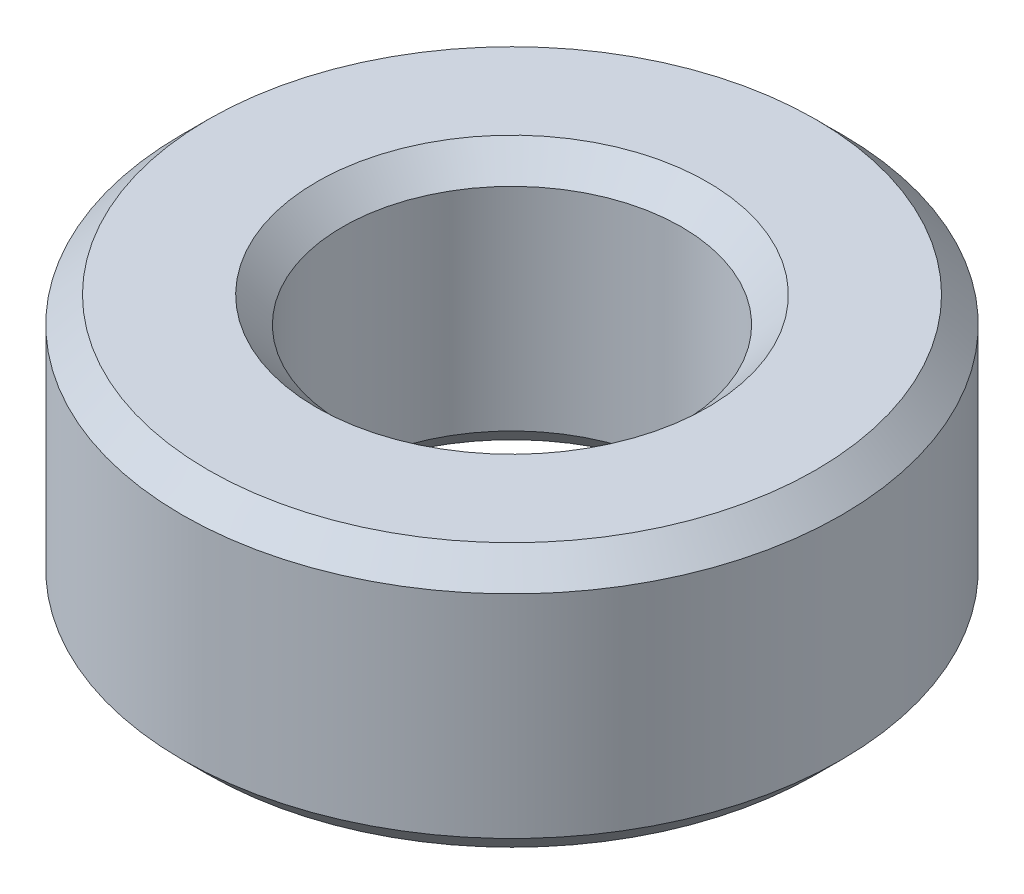
ISO-10303-21;
HEADER;
FILE_DESCRIPTION(('STEP AP214'),'2;1');
FILE_NAME('part.step','',(''),(''),'','','');
FILE_SCHEMA(('AUTOMOTIVE_DESIGN { 1 0 10303 214 1 1 1 1 }'));
ENDSEC;
DATA;
#1=APPLICATION_CONTEXT('core data for automotive mechanical design processes');
#2=APPLICATION_PROTOCOL_DEFINITION('international standard','automotive_design',2000,#1);
#3=PRODUCT_CONTEXT('',#1,'mechanical');
#4=PRODUCT('Part','Part','',(#3));
#5=PRODUCT_RELATED_PRODUCT_CATEGORY('part','',(#4));
#6=PRODUCT_DEFINITION_FORMATION('','',#4);
#7=PRODUCT_DEFINITION_CONTEXT('part definition',#1,'design');
#8=PRODUCT_DEFINITION('design','',#6,#7);
#9=PRODUCT_DEFINITION_SHAPE('','',#8);
#10=(LENGTH_UNIT() NAMED_UNIT(*) SI_UNIT(.MILLI.,.METRE.));
#11=(NAMED_UNIT(*) PLANE_ANGLE_UNIT() SI_UNIT($,.RADIAN.));
#12=(NAMED_UNIT(*) SI_UNIT($,.STERADIAN.) SOLID_ANGLE_UNIT());
#13=UNCERTAINTY_MEASURE_WITH_UNIT(LENGTH_MEASURE(1.E-05),#10,'distance_accuracy_value','');
#14=(GEOMETRIC_REPRESENTATION_CONTEXT(3) GLOBAL_UNCERTAINTY_ASSIGNED_CONTEXT((#13)) GLOBAL_UNIT_ASSIGNED_CONTEXT((#10,
#11,#12)) REPRESENTATION_CONTEXT('',''));
#15=CARTESIAN_POINT('',(0.,0.,0.));
#16=DIRECTION('',(0.,0.,1.));
#17=DIRECTION('',(1.,0.,0.));
#18=AXIS2_PLACEMENT_3D('',#15,#16,#17);
#19=CARTESIAN_POINT('',(0.,5.08,0.));
#20=DIRECTION('',(0.,-1.,0.));
#21=DIRECTION('',(0.,0.,-1.));
#22=AXIS2_PLACEMENT_3D('',#19,#20,#21);
#23=CYLINDRICAL_SURFACE('',#22,6.35);
#24=CARTESIAN_POINT('',(0.,0.500000000000001,0.));
#25=DIRECTION('',(0.,1.,0.));
#26=DIRECTION('',(0.,0.,1.));
#27=AXIS2_PLACEMENT_3D('',#24,#25,#26);
#28=CIRCLE('',#27,6.35);
#29=CARTESIAN_POINT('',(0.,0.500000000000001,6.35));
#30=VERTEX_POINT('',#29);
#31=EDGE_CURVE('E56',#30,#30,#28,.T.);
#32=ORIENTED_EDGE('',*,*,#31,.T.);
#33=EDGE_LOOP('',(#32));
#34=FACE_BOUND('',#33,.T.);
#35=CARTESIAN_POINT('',(0.,4.58,0.));
#36=DIRECTION('',(0.,1.,0.));
#37=DIRECTION('',(0.,0.,1.));
#38=AXIS2_PLACEMENT_3D('',#35,#36,#37);
#39=CIRCLE('',#38,6.35);
#40=CARTESIAN_POINT('',(0.,4.58,6.35));
#41=VERTEX_POINT('',#40);
#42=EDGE_CURVE('E59',#41,#41,#39,.F.);
#43=ORIENTED_EDGE('',*,*,#42,.T.);
#44=EDGE_LOOP('',(#43));
#45=FACE_BOUND('',#44,.T.);
#46=ADVANCED_FACE('F30',(#34,#45),#23,.T.);
#47=CARTESIAN_POINT('',(0.,5.08,0.));
#48=DIRECTION('',(0.,1.,0.));
#49=DIRECTION('',(0.,0.,1.));
#50=AXIS2_PLACEMENT_3D('',#47,#48,#49);
#51=PLANE('',#50);
#52=CARTESIAN_POINT('',(0.,5.08,0.));
#53=DIRECTION('',(0.,1.,0.));
#54=DIRECTION('',(0.,0.,1.));
#55=AXIS2_PLACEMENT_3D('',#52,#53,#54);
#56=CIRCLE('',#55,5.85);
#57=CARTESIAN_POINT('',(0.,5.08,5.85));
#58=VERTEX_POINT('',#57);
#59=EDGE_CURVE('E10',#58,#58,#56,.T.);
#60=ORIENTED_EDGE('',*,*,#59,.T.);
#61=EDGE_LOOP('',(#60));
#62=FACE_BOUND('',#61,.T.);
#63=CARTESIAN_POINT('',(0.,5.08,0.));
#64=DIRECTION('',(0.,1.,0.));
#65=DIRECTION('',(0.,0.,1.));
#66=AXIS2_PLACEMENT_3D('',#63,#64,#65);
#67=CIRCLE('',#66,3.76389999999999);
#68=CARTESIAN_POINT('',(0.,5.08,3.76389999999999));
#69=VERTEX_POINT('',#68);
#70=EDGE_CURVE('E37',#69,#69,#67,.F.);
#71=ORIENTED_EDGE('',*,*,#70,.T.);
#72=EDGE_LOOP('',(#71));
#73=FACE_BOUND('',#72,.T.);
#74=ADVANCED_FACE('F77',(#62,#73),#51,.T.);
#75=CARTESIAN_POINT('',(0.,0.,0.));
#76=DIRECTION('',(0.,1.,0.));
#77=DIRECTION('',(0.,0.,1.));
#78=AXIS2_PLACEMENT_3D('',#75,#76,#77);
#79=PLANE('',#78);
#80=CARTESIAN_POINT('',(0.,0.,0.));
#81=DIRECTION('',(0.,1.,0.));
#82=DIRECTION('',(0.,0.,1.));
#83=AXIS2_PLACEMENT_3D('',#80,#81,#82);
#84=CIRCLE('',#83,5.85);
#85=CARTESIAN_POINT('',(0.,0.,5.85));
#86=VERTEX_POINT('',#85);
#87=EDGE_CURVE('E50',#86,#86,#84,.F.);
#88=ORIENTED_EDGE('',*,*,#87,.T.);
#89=EDGE_LOOP('',(#88));
#90=FACE_BOUND('',#89,.T.);
#91=CARTESIAN_POINT('',(0.,0.,0.));
#92=DIRECTION('',(0.,1.,0.));
#93=DIRECTION('',(0.,0.,1.));
#94=AXIS2_PLACEMENT_3D('',#91,#92,#93);
#95=CIRCLE('',#94,3.7639);
#96=CARTESIAN_POINT('',(0.,0.,3.7639));
#97=VERTEX_POINT('',#96);
#98=EDGE_CURVE('E53',#97,#97,#95,.T.);
#99=ORIENTED_EDGE('',*,*,#98,.T.);
#100=EDGE_LOOP('',(#99));
#101=FACE_BOUND('',#100,.T.);
#102=ADVANCED_FACE('F83',(#90,#101),#79,.F.);
#103=CARTESIAN_POINT('',(0.,5.08,0.));
#104=DIRECTION('',(0.,1.,0.));
#105=DIRECTION('',(0.,0.,1.));
#106=AXIS2_PLACEMENT_3D('',#103,#104,#105);
#107=CYLINDRICAL_SURFACE('',#106,3.26389999999999);
#108=CARTESIAN_POINT('',(0.,0.500000000000008,0.));
#109=DIRECTION('',(0.,1.,0.));
#110=DIRECTION('',(0.,0.,1.));
#111=AXIS2_PLACEMENT_3D('',#108,#109,#110);
#112=CIRCLE('',#111,3.26389999999999);
#113=CARTESIAN_POINT('',(0.,0.500000000000008,3.26389999999999));
#114=VERTEX_POINT('',#113);
#115=EDGE_CURVE('E41',#114,#114,#112,.F.);
#116=ORIENTED_EDGE('',*,*,#115,.T.);
#117=EDGE_LOOP('',(#116));
#118=FACE_BOUND('',#117,.T.);
#119=CARTESIAN_POINT('',(0.,4.58000000000001,0.));
#120=DIRECTION('',(0.,1.,0.));
#121=DIRECTION('',(0.,0.,1.));
#122=AXIS2_PLACEMENT_3D('',#119,#120,#121);
#123=CIRCLE('',#122,3.26389999999999);
#124=CARTESIAN_POINT('',(0.,4.58000000000001,3.26389999999999));
#125=VERTEX_POINT('',#124);
#126=EDGE_CURVE('E45',#125,#125,#123,.T.);
#127=ORIENTED_EDGE('',*,*,#126,.T.);
#128=EDGE_LOOP('',(#127));
#129=FACE_BOUND('',#128,.T.);
#130=ADVANCED_FACE('F88',(#118,#129),#107,.F.);
#131=CARTESIAN_POINT('',(0.,0.500000000000001,0.));
#132=DIRECTION('',(0.,1.,0.));
#133=DIRECTION('',(0.,0.,1.));
#134=AXIS2_PLACEMENT_3D('',#131,#132,#133);
#135=CONICAL_SURFACE('',#134,6.35,0.785398163397448);
#136=ORIENTED_EDGE('',*,*,#87,.F.);
#137=EDGE_LOOP('',(#136));
#138=FACE_BOUND('',#137,.T.);
#139=ORIENTED_EDGE('',*,*,#31,.F.);
#140=EDGE_LOOP('',(#139));
#141=FACE_BOUND('',#140,.T.);
#142=ADVANCED_FACE('F73',(#138,#141),#135,.T.);
#143=CARTESIAN_POINT('',(0.,0.,0.));
#144=DIRECTION('',(0.,-1.,0.));
#145=DIRECTION('',(0.,0.,-1.));
#146=AXIS2_PLACEMENT_3D('',#143,#144,#145);
#147=CONICAL_SURFACE('',#146,3.7639,0.785398163397446);
#148=ORIENTED_EDGE('',*,*,#115,.F.);
#149=EDGE_LOOP('',(#148));
#150=FACE_BOUND('',#149,.T.);
#151=ORIENTED_EDGE('',*,*,#98,.F.);
#152=EDGE_LOOP('',(#151));
#153=FACE_BOUND('',#152,.T.);
#154=ADVANCED_FACE('F67',(#150,#153),#147,.F.);
#155=CARTESIAN_POINT('',(0.,5.08,0.));
#156=DIRECTION('',(0.,-1.,0.));
#157=DIRECTION('',(0.,0.,-1.));
#158=AXIS2_PLACEMENT_3D('',#155,#156,#157);
#159=CONICAL_SURFACE('',#158,5.85,0.785398163397449);
#160=ORIENTED_EDGE('',*,*,#42,.F.);
#161=EDGE_LOOP('',(#160));
#162=FACE_BOUND('',#161,.T.);
#163=ORIENTED_EDGE('',*,*,#59,.F.);
#164=EDGE_LOOP('',(#163));
#165=FACE_BOUND('',#164,.T.);
#166=ADVANCED_FACE('F64',(#162,#165),#159,.T.);
#167=CARTESIAN_POINT('',(0.,4.58000000000001,0.));
#168=DIRECTION('',(0.,1.,0.));
#169=DIRECTION('',(0.,0.,1.));
#170=AXIS2_PLACEMENT_3D('',#167,#168,#169);
#171=CONICAL_SURFACE('',#170,3.26389999999999,0.785398163397452);
#172=ORIENTED_EDGE('',*,*,#70,.F.);
#173=EDGE_LOOP('',(#172));
#174=FACE_BOUND('',#173,.T.);
#175=ORIENTED_EDGE('',*,*,#126,.F.);
#176=EDGE_LOOP('',(#175));
#177=FACE_BOUND('',#176,.T.);
#178=ADVANCED_FACE('F32',(#174,#177),#171,.F.);
#179=CLOSED_SHELL('',(#46,#74,#102,#130,#142,#154,#166,#178));
#180=MANIFOLD_SOLID_BREP('B2',#179);
#181=ADVANCED_BREP_SHAPE_REPRESENTATION('',(#18,#180),#14);
#182=SHAPE_DEFINITION_REPRESENTATION(#9,#181);
ENDSEC;
END-ISO-10303-21;
